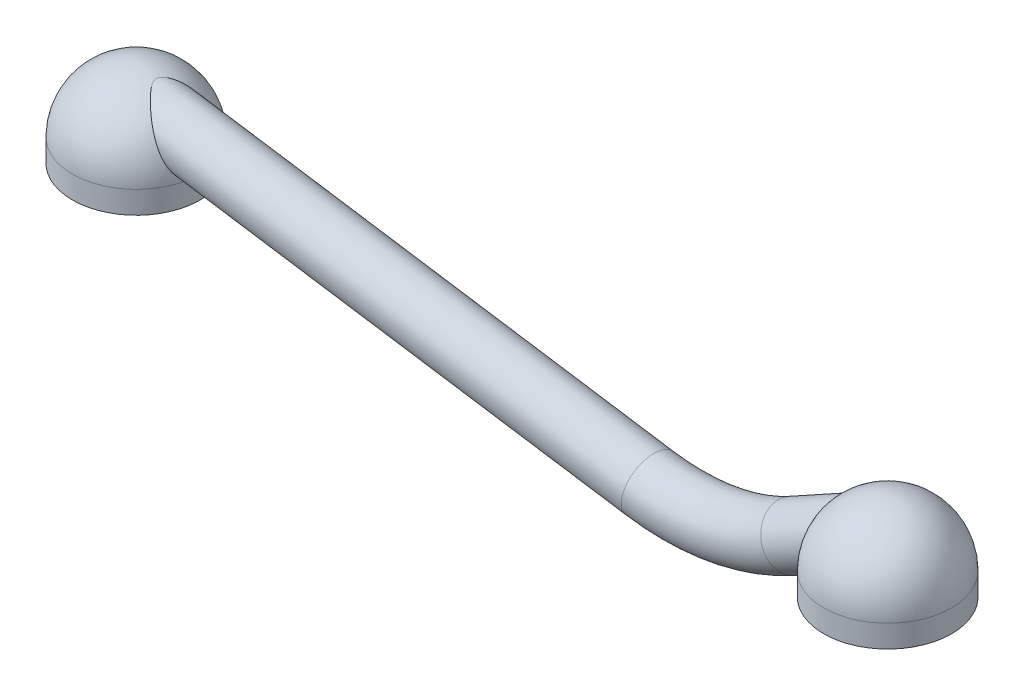
ISO-10303-21;
HEADER;
FILE_DESCRIPTION(('STEP AP214'),'2;1');
FILE_NAME('part.step','',(''),(''),'','','');
FILE_SCHEMA(('AUTOMOTIVE_DESIGN { 1 0 10303 214 1 1 1 1 }'));
ENDSEC;
DATA;
#1=APPLICATION_CONTEXT('core data for automotive mechanical design processes');
#2=APPLICATION_PROTOCOL_DEFINITION('international standard','automotive_design',2000,#1);
#3=PRODUCT_CONTEXT('',#1,'mechanical');
#4=PRODUCT('Part','Part','',(#3));
#5=PRODUCT_RELATED_PRODUCT_CATEGORY('part','',(#4));
#6=PRODUCT_DEFINITION_FORMATION('','',#4);
#7=PRODUCT_DEFINITION_CONTEXT('part definition',#1,'design');
#8=PRODUCT_DEFINITION('design','',#6,#7);
#9=PRODUCT_DEFINITION_SHAPE('','',#8);
#10=(LENGTH_UNIT() NAMED_UNIT(*) SI_UNIT(.MILLI.,.METRE.));
#11=(NAMED_UNIT(*) PLANE_ANGLE_UNIT() SI_UNIT($,.RADIAN.));
#12=(NAMED_UNIT(*) SI_UNIT($,.STERADIAN.) SOLID_ANGLE_UNIT());
#13=UNCERTAINTY_MEASURE_WITH_UNIT(LENGTH_MEASURE(1.E-05),#10,'distance_accuracy_value','');
#14=(GEOMETRIC_REPRESENTATION_CONTEXT(3) GLOBAL_UNCERTAINTY_ASSIGNED_CONTEXT((#13)) GLOBAL_UNIT_ASSIGNED_CONTEXT((#10,
#11,#12)) REPRESENTATION_CONTEXT('',''));
#15=CARTESIAN_POINT('',(0.,0.,0.));
#16=DIRECTION('',(0.,0.,1.));
#17=DIRECTION('',(1.,0.,0.));
#18=AXIS2_PLACEMENT_3D('',#15,#16,#17);
#19=CARTESIAN_POINT('',(32.0789472983026,0.223299033624261,0.));
#20=DIRECTION('',(0.875245927697039,0.483678163709868,0.));
#21=DIRECTION('',(-0.483678163709868,0.875245927697039,0.));
#22=AXIS2_PLACEMENT_3D('',#19,#20,#21);
#23=CYLINDRICAL_SURFACE('',#22,1.25);
#24=CARTESIAN_POINT('',(32.0789472983026,0.22329903362426,0.));
#25=DIRECTION('',(0.875245927697037,0.483678163709871,0.));
#26=DIRECTION('',(-0.483678163709871,0.875245927697037,0.));
#27=AXIS2_PLACEMENT_3D('',#24,#25,#26);
#28=CIRCLE('',#27,1.25);
#29=CARTESIAN_POINT('',(32.6835450029399,-0.870758375997028,0.));
#30=VERTEX_POINT('',#29);
#31=EDGE_CURVE('E153',#30,#30,#28,.T.);
#32=ORIENTED_EDGE('',*,*,#31,.T.);
#33=EDGE_LOOP('',(#32));
#34=FACE_BOUND('',#33,.T.);
#35=CARTESIAN_POINT('',(33.7846377844802,1.,-1.2415380393621));
#36=CARTESIAN_POINT('',(33.7820545257224,0.946325279180388,-1.23617573433138));
#37=CARTESIAN_POINT('',(33.7782911424591,0.89298602467663,-1.22838209459217));
#38=CARTESIAN_POINT('',(33.7687560143059,0.787395405528054,-1.20822968675943));
#39=CARTESIAN_POINT('',(33.7629857412324,0.735143273289198,-1.19587426378674));
#40=CARTESIAN_POINT('',(33.7499529124674,0.633383675564011,-1.167258187213));
#41=CARTESIAN_POINT('',(33.7427323434643,0.583840190463614,-1.15110561148538));
#42=CARTESIAN_POINT('',(33.7270466210076,0.486411310887046,-1.11490143234217));
#43=CARTESIAN_POINT('',(33.7185813699482,0.438526046809664,-1.09484952310827));
#44=CARTESIAN_POINT('',(33.696353109592,0.321704024075289,-1.0401493498465));
#45=CARTESIAN_POINT('',(33.6820256432046,0.253940113270196,-1.00316154516125));
#46=CARTESIAN_POINT('',(33.6597089841137,0.155912187699937,-0.940920584411286));
#47=CARTESIAN_POINT('',(33.6520545889038,0.123545316501064,-0.918799899289011));
#48=CARTESIAN_POINT('',(33.6366604982519,0.0604696618147197,-0.872287924081453));
#49=CARTESIAN_POINT('',(33.6289207409202,0.0297621916207992,-0.847894875998892));
#50=CARTESIAN_POINT('',(33.6212194568862,0.,-0.822348312774893));
#51=B_SPLINE_CURVE_WITH_KNOTS('',3,(#35,#36,#37,#38,#39,#40,#41,#42,#43,#44,#45,#46,#47,#48,#49,
#50),.UNSPECIFIED.,.F.,.F.,(4,2,2,2,2,2,2,4),(0.,0.161890868627858,0.323663258932948,
0.481294036504458,0.638937181787716,0.873769555325072,0.993518003563271,1.11335987613558),.UNSPECIFIED.);
#52=CARTESIAN_POINT('',(33.7846377844802,1.,-1.2415380393621));
#53=VERTEX_POINT('',#52);
#54=CARTESIAN_POINT('',(33.6212194568862,0.,-0.822348312774892));
#55=VERTEX_POINT('',#54);
#56=EDGE_CURVE('E54',#53,#55,#51,.T.);
#57=ORIENTED_EDGE('',*,*,#56,.T.);
#58=CARTESIAN_POINT('',(31.6748737128025,0.,0.));
#59=DIRECTION('',(0.,1.,0.));
#60=DIRECTION('',(1.,0.,0.));
#61=AXIS2_PLACEMENT_3D('',#58,#59,#60);
#62=ELLIPSE('',#61,2.5843631029616,1.25);
#63=CARTESIAN_POINT('',(33.6212194568862,0.,0.822348312774892));
#64=VERTEX_POINT('',#63);
#65=EDGE_CURVE('E11',#55,#64,#62,.F.);
#66=ORIENTED_EDGE('',*,*,#65,.T.);
#67=CARTESIAN_POINT('',(33.6212194568862,0.,0.822348312774893));
#68=CARTESIAN_POINT('',(33.6316210398364,0.040197930308272,0.856835122293637));
#69=CARTESIAN_POINT('',(33.6420913617214,0.082114670016142,0.889239515535644));
#70=CARTESIAN_POINT('',(33.6627788154103,0.168853644254187,0.949938067151548));
#71=CARTESIAN_POINT('',(33.6729960858918,0.213674236425883,0.978234520042674));
#72=CARTESIAN_POINT('',(33.6925445610759,0.304550802199892,1.03013400198605));
#73=CARTESIAN_POINT('',(33.7018917988824,0.350545328520041,1.05383904887518));
#74=CARTESIAN_POINT('',(33.7196553351771,0.44447417831527,1.09742461401249));
#75=CARTESIAN_POINT('',(33.7280716080817,0.492408555049229,1.11730502716844));
#76=CARTESIAN_POINT('',(33.7474769425729,0.613921295645395,1.16199370932577));
#77=CARTESIAN_POINT('',(33.7576983688577,0.688527744341245,1.18442396831211));
#78=CARTESIAN_POINT('',(33.7701837195155,0.803082859683716,1.21125801927155));
#79=CARTESIAN_POINT('',(33.7738925709911,0.842099255728042,1.21910911283899));
#80=CARTESIAN_POINT('',(33.7801621222195,0.920680316030772,1.23226741794585));
#81=CARTESIAN_POINT('',(33.7827219036883,0.960245392833819,1.23757259513894));
#82=CARTESIAN_POINT('',(33.7846377844802,1.,1.2415380393621));
#83=B_SPLINE_CURVE_WITH_KNOTS('',3,(#67,#68,#69,#70,#71,#72,#73,#74,#75,#76,#77,#78,#79,#80,#81,
#82),.UNSPECIFIED.,.F.,.F.,(4,2,2,2,2,2,2,4),(0.,0.161806331860474,0.323521935098634,
0.481077134141028,0.638636661823233,0.873609685000909,0.993436301290442,1.11335850776127),.UNSPECIFIED.);
#84=CARTESIAN_POINT('',(33.7846377844802,1.,1.2415380393621));
#85=VERTEX_POINT('',#84);
#86=EDGE_CURVE('E88',#64,#85,#83,.T.);
#87=ORIENTED_EDGE('',*,*,#86,.T.);
#88=CARTESIAN_POINT('',(33.7846281427151,0.999800000000008,1.24151810049255));
#89=CARTESIAN_POINT('',(33.7871840022532,1.05285432762649,1.2468069090801));
#90=CARTESIAN_POINT('',(33.7901948719126,1.1060926566811,1.24959349364745));
#91=CARTESIAN_POINT('',(33.7971832570266,1.21251314731989,1.25032409353387));
#92=CARTESIAN_POINT('',(33.8011602622253,1.26569532371849,1.24827066010055));
#93=CARTESIAN_POINT('',(33.8145979625853,1.4242280253659,1.235128544432));
#94=CARTESIAN_POINT('',(33.8255827889161,1.5289492162773,1.21709336288424));
#95=CARTESIAN_POINT('',(33.8508487690168,1.72655023897379,1.16566269141909));
#96=CARTESIAN_POINT('',(33.8648656036256,1.81975588412716,1.13335547381398));
#97=CARTESIAN_POINT('',(33.8963071804566,1.99960738993009,1.05477226165404));
#98=CARTESIAN_POINT('',(33.9137346176799,2.08624798739404,1.0084852046475));
#99=CARTESIAN_POINT('',(33.9490871743031,2.2410979596206,0.908619275772173));
#100=CARTESIAN_POINT('',(33.966734488251,2.31028399456609,0.856451561344628));
#101=CARTESIAN_POINT('',(34.0029434979345,2.43921881120059,0.741762461536246));
#102=CARTESIAN_POINT('',(34.0215036458201,2.49898289147631,0.679258205141217));
#103=CARTESIAN_POINT('',(34.0511673610256,2.58745867605818,0.566771737742555));
#104=CARTESIAN_POINT('',(34.0626600473944,2.61981841086822,0.519760804282628));
#105=CARTESIAN_POINT('',(34.0839378469981,2.67733461915178,0.421148970987908));
#106=CARTESIAN_POINT('',(34.0937258404985,2.70250328973524,0.369556040150536));
#107=CARTESIAN_POINT('',(34.1084919741777,2.73946650533284,0.273042751118715));
#108=CARTESIAN_POINT('',(34.1140409757301,2.7529306480027,0.22885804574663));
#109=CARTESIAN_POINT('',(34.122323445492,2.77281320093358,0.138684800178494));
#110=CARTESIAN_POINT('',(34.1250607975396,2.77924133111416,0.0926988395890345));
#111=CARTESIAN_POINT('',(34.1272462662652,2.78438467976053,2.23985807744858E-05));
#112=CARTESIAN_POINT('',(34.126681483193,2.78306964952328,-0.0466701331590823));
#113=CARTESIAN_POINT('',(34.1223404179415,2.77281233685947,-0.139064271066452));
#114=CARTESIAN_POINT('',(34.1185610742601,2.76386278339671,-0.184764889985369));
#115=CARTESIAN_POINT('',(34.1073941552372,2.73673229198995,-0.283044887100779));
#116=CARTESIAN_POINT('',(34.0994295163218,2.71704527943951,-0.335135485873841));
#117=CARTESIAN_POINT('',(34.0811706040563,2.66991963438362,-0.43524978719417));
#118=CARTESIAN_POINT('',(34.070870994825,2.64246321095938,-0.483263823025968));
#119=CARTESIAN_POINT('',(34.0442873990107,2.56783608465862,-0.595546524019505));
#120=CARTESIAN_POINT('',(34.0273906419525,2.51734559327886,-0.657451930319642));
#121=CARTESIAN_POINT('',(33.9936292390621,2.40717448454431,-0.772347847873498));
#122=CARTESIAN_POINT('',(33.9767646466217,2.34748413313881,-0.825328790730321));
#123=CARTESIAN_POINT('',(33.9437313470503,2.21869597325028,-0.924262473231629));
#124=CARTESIAN_POINT('',(33.9276111041935,2.14933276143954,-0.969884730250247));
#125=CARTESIAN_POINT('',(33.8975099776044,2.00470543199783,-1.05142054432937));
#126=CARTESIAN_POINT('',(33.8835295689421,1.92944000959526,-1.08733194681155));
#127=CARTESIAN_POINT('',(33.8552779561909,1.75744558636775,-1.15572960129845));
#128=CARTESIAN_POINT('',(33.8416128054842,1.65962433569172,-1.18574594976142));
#129=CARTESIAN_POINT('',(33.8182040750098,1.45999201135853,-1.229417276318));
#130=CARTESIAN_POINT('',(33.8084555551997,1.35818614258699,-1.24309290821468));
#131=CARTESIAN_POINT('',(33.7972881793065,1.21323027402068,-1.25001618380367));
#132=CARTESIAN_POINT('',(33.7943252520196,1.17046103757079,-1.25052323607632));
#133=CARTESIAN_POINT('',(33.7890209967545,1.0850209379734,-1.24839320158353));
#134=CARTESIAN_POINT('',(33.7866788400487,1.04235001983152,-1.24576033271117));
#135=CARTESIAN_POINT('',(33.7846281427151,0.999800000000007,-1.24151810049255));
#136=B_SPLINE_CURVE_WITH_KNOTS('',3,(#88,#89,#90,#91,#92,#93,#94,#95,#96,#97,#98,#99,#100,#101,
#102,#103,#104,#105,#106,#107,#108,#109,#110,#111,#112,#113,#114,#115,#116,#117,#118,#119,#120,
#121,#122,#123,#124,#125,#126,#127,#128,#129,#130,#131,#132,#133,#134,#135),.UNSPECIFIED.,.F.,
.F.,(4,2,2,2,2,2,2,2,2,2,2,2,2,2,2,2,2,2,2,2,2,2,2,4),(0.,0.1599969179932,0.319909518022863,
0.638592209088189,0.936314956719233,1.23427391674295,1.49862828757123,1.7625488998378,
1.93670762851487,2.11056918035138,2.24957825337561,2.38839504860112,2.52775449133086,
2.66724680683406,2.83507863735249,3.00329793437121,3.24693427170419,3.49083018458519,
3.74370360594853,3.99663308719684,4.30492042847941,4.61281769725617,4.74134200842186,
4.86969386565708),.UNSPECIFIED.);
#137=EDGE_CURVE('E78',#85,#53,#136,.T.);
#138=ORIENTED_EDGE('',*,*,#137,.T.);
#139=EDGE_LOOP('',(#57,#66,#87,#138));
#140=FACE_BOUND('',#139,.T.);
#141=ADVANCED_FACE('F44',(#34,#140),#23,.T.);
#142=CARTESIAN_POINT('',(2.85,1.,0.));
#143=DIRECTION('',(0.,1.,0.));
#144=DIRECTION('',(-1.,0.,0.));
#145=AXIS2_PLACEMENT_3D('',#142,#143,#144);
#146=SPHERICAL_SURFACE('',#145,1.9);
#147=CARTESIAN_POINT('',(2.85,0.999999999999999,0.));
#148=DIRECTION('',(0.,1.,0.));
#149=DIRECTION('',(0.,0.,1.));
#150=AXIS2_PLACEMENT_3D('',#147,#148,#149);
#151=CIRCLE('',#150,1.9);
#152=CARTESIAN_POINT('',(2.85,0.999999999999999,1.9));
#153=VERTEX_POINT('',#152);
#154=EDGE_CURVE('E155',#153,#153,#151,.T.);
#155=ORIENTED_EDGE('',*,*,#154,.F.);
#156=EDGE_LOOP('',(#155));
#157=FACE_BOUND('',#156,.T.);
#158=ADVANCED_FACE('F171',(#157),#146,.F.);
#159=CARTESIAN_POINT('',(2.85,0.,0.));
#160=DIRECTION('',(0.,1.,0.));
#161=DIRECTION('',(0.,0.,1.));
#162=AXIS2_PLACEMENT_3D('',#159,#160,#161);
#163=PLANE('',#162);
#164=CARTESIAN_POINT('',(2.85,0.,0.));
#165=DIRECTION('',(0.,1.,0.));
#166=DIRECTION('',(0.,0.,1.));
#167=AXIS2_PLACEMENT_3D('',#164,#165,#166);
#168=CIRCLE('',#167,2.85);
#169=CARTESIAN_POINT('',(2.85,0.,2.85));
#170=VERTEX_POINT('',#169);
#171=EDGE_CURVE('E165',#170,#170,#168,.T.);
#172=ORIENTED_EDGE('',*,*,#171,.F.);
#173=EDGE_LOOP('',(#172));
#174=FACE_BOUND('',#173,.T.);
#175=CARTESIAN_POINT('',(2.85,0.,0.));
#176=DIRECTION('',(0.,1.,0.));
#177=DIRECTION('',(0.,0.,1.));
#178=AXIS2_PLACEMENT_3D('',#175,#176,#177);
#179=CIRCLE('',#178,1.9);
#180=CARTESIAN_POINT('',(2.85,0.,1.9));
#181=VERTEX_POINT('',#180);
#182=EDGE_CURVE('E158',#181,#181,#179,.T.);
#183=ORIENTED_EDGE('',*,*,#182,.T.);
#184=EDGE_LOOP('',(#183));
#185=FACE_BOUND('',#184,.T.);
#186=ADVANCED_FACE('F172',(#174,#185),#163,.F.);
#187=CARTESIAN_POINT('',(2.85,1.,0.));
#188=DIRECTION('',(0.,-1.,0.));
#189=DIRECTION('',(0.,0.,-1.));
#190=AXIS2_PLACEMENT_3D('',#187,#188,#189);
#191=CYLINDRICAL_SURFACE('',#190,2.85);
#192=CARTESIAN_POINT('',(2.85,1.,0.));
#193=DIRECTION('',(0.,1.,0.));
#194=DIRECTION('',(0.,0.,1.));
#195=AXIS2_PLACEMENT_3D('',#192,#193,#194);
#196=CIRCLE('',#195,2.85);
#197=CARTESIAN_POINT('',(5.65265295269441,1.,-0.517335893548211));
#198=VERTEX_POINT('',#197);
#199=CARTESIAN_POINT('',(5.65265295269441,1.,0.517335893548208));
#200=VERTEX_POINT('',#199);
#201=EDGE_CURVE('E162',#198,#200,#196,.T.);
#202=ORIENTED_EDGE('',*,*,#201,.F.);
#203=CARTESIAN_POINT('',(5.65265295269441,1.,-0.517335893548211));
#204=CARTESIAN_POINT('',(5.65777187319883,0.98646905130115,-0.48960873615163));
#205=CARTESIAN_POINT('',(5.66256521213776,0.973970144558465,-0.461328005208937));
#206=CARTESIAN_POINT('',(5.67140296441931,0.951148869150977,-0.40377464003606));
#207=CARTESIAN_POINT('',(5.67544704524839,0.94082746656112,-0.374501572201036));
#208=CARTESIAN_POINT('',(5.68628384654967,0.91336152721687,-0.28555511838121));
#209=CARTESIAN_POINT('',(5.69180809289725,0.899645459405018,-0.22461253715407));
#210=CARTESIAN_POINT('',(5.6988901157767,0.882118055121647,-0.100893156251278));
#211=CARTESIAN_POINT('',(5.70043428832416,0.878340688447898,-0.0381108055475844));
#212=CARTESIAN_POINT('',(5.69935430552441,0.880997664022855,0.087202420548451));
#213=CARTESIAN_POINT('',(5.69673106744694,0.887429759113239,0.149733348243471));
#214=CARTESIAN_POINT('',(5.68820591562192,0.908620380198492,0.264463289034453));
#215=CARTESIAN_POINT('',(5.68278570713785,0.922159634624176,0.316931541069149));
#216=CARTESIAN_POINT('',(5.66946711232858,0.956083186844139,0.419300819124439));
#217=CARTESIAN_POINT('',(5.66156805924578,0.976469326411745,0.469201150219363));
#218=CARTESIAN_POINT('',(5.65265295269441,1.00000000000001,0.51733589354821));
#219=B_SPLINE_CURVE_WITH_KNOTS('',3,(#203,#204,#205,#206,#207,#208,#209,#210,#211,#212,#213,
#214,#215,#216,#217,#218),.UNSPECIFIED.,.F.,.F.,(4,2,2,2,2,2,2,4),(0.,0.0937779206780906,
0.18759735992654,0.374760580287385,0.562562685632274,0.750323460439312,0.913147992500593,
1.07601635856477),.UNSPECIFIED.);
#220=EDGE_CURVE('E66',#198,#200,#219,.T.);
#221=ORIENTED_EDGE('',*,*,#220,.T.);
#222=EDGE_LOOP('',(#202,#221));
#223=FACE_BOUND('',#222,.T.);
#224=ORIENTED_EDGE('',*,*,#171,.T.);
#225=EDGE_LOOP('',(#224));
#226=FACE_BOUND('',#225,.T.);
#227=ADVANCED_FACE('F50',(#223,#226),#191,.T.);
#228=CARTESIAN_POINT('',(2.85,1.,0.));
#229=DIRECTION('',(0.,-1.,0.));
#230=DIRECTION('',(0.,0.,-1.));
#231=AXIS2_PLACEMENT_3D('',#228,#229,#230);
#232=CYLINDRICAL_SURFACE('',#231,1.9);
#233=ORIENTED_EDGE('',*,*,#154,.T.);
#234=EDGE_LOOP('',(#233));
#235=FACE_BOUND('',#234,.T.);
#236=ORIENTED_EDGE('',*,*,#182,.F.);
#237=EDGE_LOOP('',(#236));
#238=FACE_BOUND('',#237,.T.);
#239=ADVANCED_FACE('F180',(#235,#238),#232,.F.);
#240=CARTESIAN_POINT('',(2.85,1.,0.));
#241=DIRECTION('',(0.,1.,0.));
#242=DIRECTION('',(-1.,0.,0.));
#243=AXIS2_PLACEMENT_3D('',#240,#241,#242);
#244=SPHERICAL_SURFACE('',#243,2.85);
#245=ORIENTED_EDGE('',*,*,#201,.T.);
#246=CARTESIAN_POINT('',(5.65272859857106,0.9998,0.516925877425284));
#247=CARTESIAN_POINT('',(5.64684014560395,1.01536718804577,0.548858915689451));
#248=CARTESIAN_POINT('',(5.64040376084936,1.03229748090998,0.579998224483648));
#249=CARTESIAN_POINT('',(5.62647895165218,1.06865813371001,0.640503652691949));
#250=CARTESIAN_POINT('',(5.6189912738475,1.08808671851913,0.669871009580846));
#251=CARTESIAN_POINT('',(5.59510433267943,1.14955718767999,0.754743997421192));
#252=CARTESIAN_POINT('',(5.57720571522484,1.19498599603366,0.807427854026703));
#253=CARTESIAN_POINT('',(5.5378788649357,1.29272578345955,0.90400318348188));
#254=CARTESIAN_POINT('',(5.5164595930896,1.34501922390053,0.947916367125615));
#255=CARTESIAN_POINT('',(5.47040207781542,1.45477851782379,1.02677785049162));
#256=CARTESIAN_POINT('',(5.44575952524171,1.51225126285024,1.06171396020214));
#257=CARTESIAN_POINT('',(5.3909029474833,1.63675123544743,1.12564676286713));
#258=CARTESIAN_POINT('',(5.36037597642399,1.7041502511991,1.15364649952488));
#259=CARTESIAN_POINT('',(5.29625255640039,1.84104129128468,1.19884509318455));
#260=CARTESIAN_POINT('',(5.26265510965263,1.91053399103045,1.21604042478307));
#261=CARTESIAN_POINT('',(5.18719636445837,2.06093776743311,1.24208158622821));
#262=CARTESIAN_POINT('',(5.14486834579041,2.14191704996896,1.24917751666234));
#263=CARTESIAN_POINT('',(5.05701494098821,2.30220195114005,1.25068831765891));
#264=CARTESIAN_POINT('',(5.01148838322485,2.38150694250074,1.24509851770494));
#265=CARTESIAN_POINT('',(4.91004483942573,2.54923482951937,1.22059087227735));
#266=CARTESIAN_POINT('',(4.85363565638042,2.63706786020207,1.19967057304552));
#267=CARTESIAN_POINT('',(4.73751406209722,2.80609006845364,1.14417614005122));
#268=CARTESIAN_POINT('',(4.67779697819955,2.88726942429658,1.1095822453763));
#269=CARTESIAN_POINT('',(4.54675625246237,3.05248640895973,1.02257374242122));
#270=CARTESIAN_POINT('',(4.47501191283106,3.1352076038537,0.968293484685771));
#271=CARTESIAN_POINT('',(4.32927987490631,3.2874463444751,0.846508087524483));
#272=CARTESIAN_POINT('',(4.25529897147602,3.3569999756469,0.779040152514658));
#273=CARTESIAN_POINT('',(4.14411164945638,3.45046982835278,0.668378032102923));
#274=CARTESIAN_POINT('',(4.10687747195738,3.47990330471562,0.629756118994706));
#275=CARTESIAN_POINT('',(4.03288330385628,3.53490214206864,0.548926893588078));
#276=CARTESIAN_POINT('',(3.99612636888293,3.56044865037016,0.506703565688904));
#277=CARTESIAN_POINT('',(3.92421316812607,3.60730437600401,0.417646083173246));
#278=CARTESIAN_POINT('',(3.88908481185606,3.62855249222655,0.370757913108833));
#279=CARTESIAN_POINT('',(3.82454928239945,3.66515450949545,0.271071699283149));
#280=CARTESIAN_POINT('',(3.79508858111443,3.68056504165957,0.218337210006112));
#281=CARTESIAN_POINT('',(3.76540776101104,3.69550312186783,0.139208678672755));
#282=CARTESIAN_POINT('',(3.75830201435822,3.6989899002102,0.116305645103806));
#283=CARTESIAN_POINT('',(3.74775462451209,3.70412307534142,0.0695158165788793));
#284=CARTESIAN_POINT('',(3.74429859311233,3.705776700231,0.0456332731758491));
#285=CARTESIAN_POINT('',(3.74172509632742,3.70701088286955,-0.00262174018717372));
#286=CARTESIAN_POINT('',(3.74264129792052,3.70657535362397,-0.0269965681145374));
#287=CARTESIAN_POINT('',(3.74868160505684,3.70366800272283,-0.0751263705916424));
#288=CARTESIAN_POINT('',(3.75381850311311,3.70118999043106,-0.0988792338884184));
#289=CARTESIAN_POINT('',(3.76971330299331,3.69335865835511,-0.153413644874602));
#290=CARTESIAN_POINT('',(3.78182281959091,3.68729489539489,-0.183679140423207));
#291=CARTESIAN_POINT('',(3.80955410213455,3.67288299300393,-0.241980808339947));
#292=CARTESIAN_POINT('',(3.82518901935733,3.66452627385977,-0.270008086920409));
#293=CARTESIAN_POINT('',(3.86451624608505,3.64266102682151,-0.334128655553538));
#294=CARTESIAN_POINT('',(3.8890641339319,3.62838609527145,-0.369423228195533));
#295=CARTESIAN_POINT('',(3.93993952961883,3.59715218035454,-0.437480205662559));
#296=CARTESIAN_POINT('',(3.96627019074113,3.5801883660149,-0.4702378918222));
#297=CARTESIAN_POINT('',(4.04662430455635,3.52565381618557,-0.565599901778948));
#298=CARTESIAN_POINT('',(4.10188802910466,3.48450505418776,-0.625119210764756));
#299=CARTESIAN_POINT('',(4.23740930315697,3.37351272709132,-0.762482263001466));
#300=CARTESIAN_POINT('',(4.31774073634666,3.29908321595567,-0.836544372049025));
#301=CARTESIAN_POINT('',(4.47550860620246,3.13507993729424,-0.969004203018497));
#302=CARTESIAN_POINT('',(4.55294867660276,3.04552601734347,-1.02742219803321));
#303=CARTESIAN_POINT('',(4.70372502689303,2.85359052518758,-1.12593851564716));
#304=CARTESIAN_POINT('',(4.77705872169629,2.75120100105296,-1.16602540956102));
#305=CARTESIAN_POINT('',(4.91847677685684,2.53692439476141,-1.22435688735617));
#306=CARTESIAN_POINT('',(4.98656536193506,2.42504511212521,-1.24261922581624));
#307=CARTESIAN_POINT('',(5.10034899918391,2.22466847101783,-1.25238290386269));
#308=CARTESIAN_POINT('',(5.14742566748374,2.13720884293857,-1.24937303335867));
#309=CARTESIAN_POINT('',(5.23741434991262,1.96214845434487,-1.22751474198056));
#310=CARTESIAN_POINT('',(5.28033222181644,1.87454807435876,-1.20868897082964));
#311=CARTESIAN_POINT('',(5.35514294592647,1.71565353457444,-1.15828595757236));
#312=CARTESIAN_POINT('',(5.38771697559891,1.64392004510702,-1.12910896635747));
#313=CARTESIAN_POINT('',(5.44898168943005,1.50499767862636,-1.05819871185439));
#314=CARTESIAN_POINT('',(5.47767031668353,1.4378112181212,-1.01645883524466));
#315=CARTESIAN_POINT('',(5.53078636608375,1.31034086700685,-0.920176578134561));
#316=CARTESIAN_POINT('',(5.55517614418134,1.25011940348264,-0.865530046725119));
#317=CARTESIAN_POINT('',(5.59870041844027,1.14056685881705,-0.744623660256523));
#318=CARTESIAN_POINT('',(5.6178534136089,1.09119756669049,-0.678406075802979));
#319=CARTESIAN_POINT('',(5.63743203957199,1.04005353897029,-0.5928126319575));
#320=CARTESIAN_POINT('',(5.64067133264168,1.03156316084109,-0.577896155625162));
#321=CARTESIAN_POINT('',(5.64689229455607,1.01521011577277,-0.547690349637945));
#322=CARTESIAN_POINT('',(5.64987421554063,1.00734683507238,-0.532401404154755));
#323=CARTESIAN_POINT('',(5.65272859857108,0.999799999999743,-0.516925877425441));
#324=B_SPLINE_CURVE_WITH_KNOTS('',3,(#246,#247,#248,#249,#250,#251,#252,#253,#254,#255,#256,
#257,#258,#259,#260,#261,#262,#263,#264,#265,#266,#267,#268,#269,#270,#271,#272,#273,#274,#275,
#276,#277,#278,#279,#280,#281,#282,#283,#284,#285,#286,#287,#288,#289,#290,#291,#292,#293,#294,
#295,#296,#297,#298,#299,#300,#301,#302,#303,#304,#305,#306,#307,#308,#309,#310,#311,#312,#313,
#314,#315,#316,#317,#318,#319,#320,#321,#322,#323),.UNSPECIFIED.,.F.,.F.,(4,2,2,2,2,2,2,2,2,2,2,
2,2,2,2,2,2,2,2,2,2,2,2,2,2,2,2,2,2,2,2,2,2,2,2,2,2,2,4),(0.,0.107946964336857,
0.215817647947456,0.430195592399092,0.644036106209945,0.858165478609346,1.09458680492652,
1.33108523389831,1.60497467145455,1.87896496348213,2.19710409738378,2.51570469305256,
2.88087172553039,3.24502306061381,3.42843706294522,3.6127141005582,3.79945049913641,
3.98432589106809,4.05673856089687,4.12886468155275,4.20154707842746,4.27445058462353,
4.3733660546038,4.472656813127,4.60825970291089,4.74410904389276,5.01646735915514,
5.41119324781587,5.80540511123823,6.19986241552604,6.593998604401,6.89093883600461,
7.18745454723554,7.4384659367495,7.68960969482529,7.94285382720672,8.19519146087901,
8.24758156141468,8.29991974012453),.UNSPECIFIED.);
#325=EDGE_CURVE('E87',#200,#198,#324,.T.);
#326=ORIENTED_EDGE('',*,*,#325,.T.);
#327=EDGE_LOOP('',(#245,#326));
#328=FACE_BOUND('',#327,.T.);
#329=ADVANCED_FACE('F179',(#328),#244,.T.);
#330=CARTESIAN_POINT('',(27.2421656612039,8.97575831059463,0.));
#331=DIRECTION('',(0.,0.,1.));
#332=DIRECTION('',(1.,0.,0.));
#333=AXIS2_PLACEMENT_3D('',#330,#331,#332);
#334=TOROIDAL_SURFACE('',#333,9.99999999999999,1.25);
#335=CARTESIAN_POINT('',(25.7353081661524,-0.910058827589108,0.));
#336=DIRECTION('',(0.988581713818375,-0.150685749505138,0.));
#337=DIRECTION('',(0.150685749505138,0.988581713818375,0.));
#338=AXIS2_PLACEMENT_3D('',#335,#336,#337);
#339=CIRCLE('',#338,1.25);
#340=CARTESIAN_POINT('',(25.546950979271,-2.14578596986206,0.));
#341=VERTEX_POINT('',#340);
#342=EDGE_CURVE('E200',#341,#341,#339,.T.);
#343=CARTESIAN_POINT('',(27.2421656612039,8.97575831059463,0.));
#344=DIRECTION('',(0.,0.,1.));
#345=DIRECTION('',(1.,0.,0.));
#346=AXIS2_PLACEMENT_3D('',#343,#344,#345);
#347=CIRCLE('',#346,11.25);
#348=EDGE_CURVE('',#341,#30,#347,.T.);
#349=ORIENTED_EDGE('',*,*,#342,.T.);
#350=ORIENTED_EDGE('',*,*,#31,.F.);
#351=ORIENTED_EDGE('',*,*,#348,.T.);
#352=ORIENTED_EDGE('',*,*,#348,.F.);
#353=EDGE_LOOP('',(#349,#351,#350,#352));
#354=FACE_BOUND('',#353,.T.);
#355=ADVANCED_FACE('F138',(#354),#334,.T.);
#356=CARTESIAN_POINT('',(2.85779150809043,2.57707399739628,0.));
#357=DIRECTION('',(0.988581713818375,-0.150685749505138,0.));
#358=DIRECTION('',(0.150685749505138,0.988581713818375,0.));
#359=AXIS2_PLACEMENT_3D('',#356,#357,#358);
#360=CYLINDRICAL_SURFACE('',#359,1.25);
#361=ORIENTED_EDGE('',*,*,#342,.F.);
#362=EDGE_LOOP('',(#361));
#363=FACE_BOUND('',#362,.T.);
#364=ORIENTED_EDGE('',*,*,#220,.F.);
#365=ORIENTED_EDGE('',*,*,#325,.F.);
#366=EDGE_LOOP('',(#364,#365));
#367=FACE_BOUND('',#366,.T.);
#368=ADVANCED_FACE('F129',(#363,#367),#360,.T.);
#369=CARTESIAN_POINT('',(36.35,0.,0.));
#370=DIRECTION('',(0.,1.,0.));
#371=DIRECTION('',(0.,0.,1.));
#372=AXIS2_PLACEMENT_3D('',#369,#370,#371);
#373=PLANE('',#372);
#374=ORIENTED_EDGE('',*,*,#65,.F.);
#375=CARTESIAN_POINT('',(36.35,0.,0.));
#376=DIRECTION('',(0.,1.,0.));
#377=DIRECTION('',(0.,0.,1.));
#378=AXIS2_PLACEMENT_3D('',#375,#376,#377);
#379=CIRCLE('',#378,2.85);
#380=EDGE_CURVE('E94',#64,#55,#379,.T.);
#381=ORIENTED_EDGE('',*,*,#380,.F.);
#382=EDGE_LOOP('',(#374,#381));
#383=FACE_BOUND('',#382,.T.);
#384=CARTESIAN_POINT('',(36.35,0.,0.));
#385=DIRECTION('',(0.,1.,0.));
#386=DIRECTION('',(0.,0.,1.));
#387=AXIS2_PLACEMENT_3D('',#384,#385,#386);
#388=CIRCLE('',#387,1.9);
#389=CARTESIAN_POINT('',(36.35,0.,1.9));
#390=VERTEX_POINT('',#389);
#391=EDGE_CURVE('E205',#390,#390,#388,.T.);
#392=ORIENTED_EDGE('',*,*,#391,.T.);
#393=EDGE_LOOP('',(#392));
#394=FACE_BOUND('',#393,.T.);
#395=ADVANCED_FACE('F124',(#383,#394),#373,.F.);
#396=CARTESIAN_POINT('',(36.35,1.,0.));
#397=DIRECTION('',(0.,-1.,0.));
#398=DIRECTION('',(0.,0.,-1.));
#399=AXIS2_PLACEMENT_3D('',#396,#397,#398);
#400=CYLINDRICAL_SURFACE('',#399,2.85);
#401=ORIENTED_EDGE('',*,*,#56,.F.);
#402=CARTESIAN_POINT('',(36.35,1.,0.));
#403=DIRECTION('',(0.,1.,0.));
#404=DIRECTION('',(0.,0.,1.));
#405=AXIS2_PLACEMENT_3D('',#402,#403,#404);
#406=CIRCLE('',#405,2.85);
#407=EDGE_CURVE('E62',#85,#53,#406,.T.);
#408=ORIENTED_EDGE('',*,*,#407,.F.);
#409=ORIENTED_EDGE('',*,*,#86,.F.);
#410=ORIENTED_EDGE('',*,*,#380,.T.);
#411=EDGE_LOOP('',(#401,#408,#409,#410));
#412=FACE_BOUND('',#411,.T.);
#413=ADVANCED_FACE('F89',(#412),#400,.T.);
#414=CARTESIAN_POINT('',(36.35,1.,0.));
#415=DIRECTION('',(0.,-1.,0.));
#416=DIRECTION('',(0.,0.,-1.));
#417=AXIS2_PLACEMENT_3D('',#414,#415,#416);
#418=CYLINDRICAL_SURFACE('',#417,1.9);
#419=CARTESIAN_POINT('',(36.35,1.,0.));
#420=DIRECTION('',(0.,1.,0.));
#421=DIRECTION('',(0.,0.,1.));
#422=AXIS2_PLACEMENT_3D('',#419,#420,#421);
#423=CIRCLE('',#422,1.9);
#424=CARTESIAN_POINT('',(36.35,1.,1.9));
#425=VERTEX_POINT('',#424);
#426=EDGE_CURVE('E92',#425,#425,#423,.T.);
#427=ORIENTED_EDGE('',*,*,#426,.T.);
#428=EDGE_LOOP('',(#427));
#429=FACE_BOUND('',#428,.T.);
#430=ORIENTED_EDGE('',*,*,#391,.F.);
#431=EDGE_LOOP('',(#430));
#432=FACE_BOUND('',#431,.T.);
#433=ADVANCED_FACE('F121',(#429,#432),#418,.F.);
#434=CARTESIAN_POINT('',(36.35,1.,0.));
#435=DIRECTION('',(0.,1.,0.));
#436=DIRECTION('',(-1.,0.,0.));
#437=AXIS2_PLACEMENT_3D('',#434,#435,#436);
#438=SPHERICAL_SURFACE('',#437,1.9);
#439=ORIENTED_EDGE('',*,*,#426,.F.);
#440=EDGE_LOOP('',(#439));
#441=FACE_BOUND('',#440,.T.);
#442=ADVANCED_FACE('F122',(#441),#438,.F.);
#443=CARTESIAN_POINT('',(36.35,1.,0.));
#444=DIRECTION('',(0.,1.,0.));
#445=DIRECTION('',(-1.,0.,0.));
#446=AXIS2_PLACEMENT_3D('',#443,#444,#445);
#447=SPHERICAL_SURFACE('',#446,2.85);
#448=ORIENTED_EDGE('',*,*,#137,.F.);
#449=ORIENTED_EDGE('',*,*,#407,.T.);
#450=EDGE_LOOP('',(#448,#449));
#451=FACE_BOUND('',#450,.T.);
#452=ADVANCED_FACE('F83',(#451),#447,.T.);
#453=CLOSED_SHELL('',(#141,#158,#186,#227,#239,#329,#355,#368,#395,#413,#433,#442,#452));
#454=MANIFOLD_SOLID_BREP('B2',#453);
#455=ADVANCED_BREP_SHAPE_REPRESENTATION('',(#18,#454),#14);
#456=SHAPE_DEFINITION_REPRESENTATION(#9,#455);
ENDSEC;
END-ISO-10303-21;
